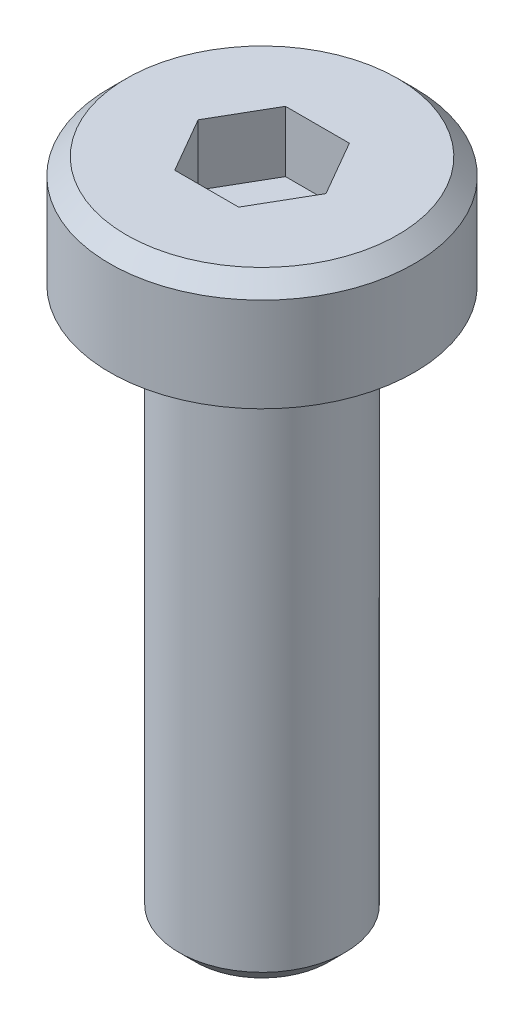
ISO-10303-21;
HEADER;
FILE_DESCRIPTION(('STEP AP214'),'2;1');
FILE_NAME('part.step','',(''),(''),'','','');
FILE_SCHEMA(('AUTOMOTIVE_DESIGN { 1 0 10303 214 1 1 1 1 }'));
ENDSEC;
DATA;
#1=APPLICATION_CONTEXT('core data for automotive mechanical design processes');
#2=APPLICATION_PROTOCOL_DEFINITION('international standard','automotive_design',2000,#1);
#3=PRODUCT_CONTEXT('',#1,'mechanical');
#4=PRODUCT('Part','Part','',(#3));
#5=PRODUCT_RELATED_PRODUCT_CATEGORY('part','',(#4));
#6=PRODUCT_DEFINITION_FORMATION('','',#4);
#7=PRODUCT_DEFINITION_CONTEXT('part definition',#1,'design');
#8=PRODUCT_DEFINITION('design','',#6,#7);
#9=PRODUCT_DEFINITION_SHAPE('','',#8);
#10=(LENGTH_UNIT() NAMED_UNIT(*) SI_UNIT(.MILLI.,.METRE.));
#11=(NAMED_UNIT(*) PLANE_ANGLE_UNIT() SI_UNIT($,.RADIAN.));
#12=(NAMED_UNIT(*) SI_UNIT($,.STERADIAN.) SOLID_ANGLE_UNIT());
#13=UNCERTAINTY_MEASURE_WITH_UNIT(LENGTH_MEASURE(1.E-05),#10,'distance_accuracy_value','');
#14=(GEOMETRIC_REPRESENTATION_CONTEXT(3) GLOBAL_UNCERTAINTY_ASSIGNED_CONTEXT((#13)) GLOBAL_UNIT_ASSIGNED_CONTEXT((#10,
#11,#12)) REPRESENTATION_CONTEXT('',''));
#15=CARTESIAN_POINT('',(0.,0.,0.));
#16=DIRECTION('',(0.,0.,1.));
#17=DIRECTION('',(1.,0.,0.));
#18=AXIS2_PLACEMENT_3D('',#15,#16,#17);
#19=CARTESIAN_POINT('',(0.,-10.,0.));
#20=DIRECTION('',(0.,-1.,0.));
#21=DIRECTION('',(0.,0.,-1.));
#22=AXIS2_PLACEMENT_3D('',#19,#20,#21);
#23=PLANE('',#22);
#24=CARTESIAN_POINT('',(0.,-10.,0.));
#25=DIRECTION('',(0.,-1.,0.));
#26=DIRECTION('',(0.,0.,-1.));
#27=AXIS2_PLACEMENT_3D('',#24,#25,#26);
#28=CIRCLE('',#27,1.2);
#29=CARTESIAN_POINT('',(0.,-10.,-1.2));
#30=VERTEX_POINT('',#29);
#31=EDGE_CURVE('E11',#30,#30,#28,.T.);
#32=ORIENTED_EDGE('',*,*,#31,.T.);
#33=EDGE_LOOP('',(#32));
#34=FACE_BOUND('',#33,.T.);
#35=ADVANCED_FACE('F44',(#34),#23,.T.);
#36=CARTESIAN_POINT('',(0.,-10.,0.));
#37=DIRECTION('',(0.,1.,0.));
#38=DIRECTION('',(0.,0.,1.));
#39=AXIS2_PLACEMENT_3D('',#36,#37,#38);
#40=CONICAL_SURFACE('',#39,1.2,0.785398163397446);
#41=CARTESIAN_POINT('',(0.,-9.7,0.));
#42=DIRECTION('',(0.,-1.,0.));
#43=DIRECTION('',(0.,0.,-1.));
#44=AXIS2_PLACEMENT_3D('',#41,#42,#43);
#45=CIRCLE('',#44,1.5);
#46=CARTESIAN_POINT('',(0.,-9.7,-1.5));
#47=VERTEX_POINT('',#46);
#48=EDGE_CURVE('E52',#47,#47,#45,.T.);
#49=ORIENTED_EDGE('',*,*,#48,.T.);
#50=EDGE_LOOP('',(#49));
#51=FACE_BOUND('',#50,.T.);
#52=ORIENTED_EDGE('',*,*,#31,.F.);
#53=EDGE_LOOP('',(#52));
#54=FACE_BOUND('',#53,.T.);
#55=ADVANCED_FACE('F189',(#51,#54),#40,.T.);
#56=CARTESIAN_POINT('',(0.,-12.,0.));
#57=DIRECTION('',(0.,-1.,0.));
#58=DIRECTION('',(0.,0.,-1.));
#59=AXIS2_PLACEMENT_3D('',#56,#57,#58);
#60=CYLINDRICAL_SURFACE('',#59,1.5);
#61=CARTESIAN_POINT('',(0.,0.,0.));
#62=DIRECTION('',(0.,-1.,0.));
#63=DIRECTION('',(0.,0.,-1.));
#64=AXIS2_PLACEMENT_3D('',#61,#62,#63);
#65=CIRCLE('',#64,1.5);
#66=CARTESIAN_POINT('',(0.,0.,-1.5));
#67=VERTEX_POINT('',#66);
#68=EDGE_CURVE('E178',#67,#67,#65,.T.);
#69=ORIENTED_EDGE('',*,*,#68,.T.);
#70=EDGE_LOOP('',(#69));
#71=FACE_BOUND('',#70,.T.);
#72=ORIENTED_EDGE('',*,*,#48,.F.);
#73=EDGE_LOOP('',(#72));
#74=FACE_BOUND('',#73,.T.);
#75=ADVANCED_FACE('F186',(#71,#74),#60,.T.);
#76=CARTESIAN_POINT('',(1.5,0.,0.));
#77=DIRECTION('',(0.,-1.,0.));
#78=DIRECTION('',(0.,0.,-1.));
#79=AXIS2_PLACEMENT_3D('',#76,#77,#78);
#80=PLANE('',#79);
#81=CARTESIAN_POINT('',(0.,0.,0.));
#82=DIRECTION('',(0.,-1.,0.));
#83=DIRECTION('',(0.,0.,-1.));
#84=AXIS2_PLACEMENT_3D('',#81,#82,#83);
#85=CIRCLE('',#84,2.75);
#86=CARTESIAN_POINT('',(0.,0.,-2.75));
#87=VERTEX_POINT('',#86);
#88=EDGE_CURVE('E177',#87,#87,#85,.T.);
#89=ORIENTED_EDGE('',*,*,#88,.T.);
#90=EDGE_LOOP('',(#89));
#91=FACE_BOUND('',#90,.T.);
#92=ORIENTED_EDGE('',*,*,#68,.F.);
#93=EDGE_LOOP('',(#92));
#94=FACE_BOUND('',#93,.T.);
#95=ADVANCED_FACE('F194',(#91,#94),#80,.T.);
#96=CARTESIAN_POINT('',(0.,-12.,0.));
#97=DIRECTION('',(0.,-1.,0.));
#98=DIRECTION('',(0.,0.,-1.));
#99=AXIS2_PLACEMENT_3D('',#96,#97,#98);
#100=CYLINDRICAL_SURFACE('',#99,2.75);
#101=CARTESIAN_POINT('',(0.,1.7,0.));
#102=DIRECTION('',(0.,-1.,0.));
#103=DIRECTION('',(0.,0.,-1.));
#104=AXIS2_PLACEMENT_3D('',#101,#102,#103);
#105=CIRCLE('',#104,2.75);
#106=CARTESIAN_POINT('',(0.,1.7,-2.75));
#107=VERTEX_POINT('',#106);
#108=EDGE_CURVE('E174',#107,#107,#105,.T.);
#109=ORIENTED_EDGE('',*,*,#108,.T.);
#110=EDGE_LOOP('',(#109));
#111=FACE_BOUND('',#110,.T.);
#112=ORIENTED_EDGE('',*,*,#88,.F.);
#113=EDGE_LOOP('',(#112));
#114=FACE_BOUND('',#113,.T.);
#115=ADVANCED_FACE('F200',(#111,#114),#100,.T.);
#116=CARTESIAN_POINT('',(0.,1.7,0.));
#117=DIRECTION('',(0.,-1.,0.));
#118=DIRECTION('',(0.,0.,-1.));
#119=AXIS2_PLACEMENT_3D('',#116,#117,#118);
#120=CONICAL_SURFACE('',#119,2.75,0.785398163397448);
#121=CARTESIAN_POINT('',(0.,2.,0.));
#122=DIRECTION('',(0.,-1.,0.));
#123=DIRECTION('',(0.,0.,-1.));
#124=AXIS2_PLACEMENT_3D('',#121,#122,#123);
#125=CIRCLE('',#124,2.45);
#126=CARTESIAN_POINT('',(0.,2.,-2.45));
#127=VERTEX_POINT('',#126);
#128=EDGE_CURVE('E157',#127,#127,#125,.T.);
#129=ORIENTED_EDGE('',*,*,#128,.T.);
#130=EDGE_LOOP('',(#129));
#131=FACE_BOUND('',#130,.T.);
#132=ORIENTED_EDGE('',*,*,#108,.F.);
#133=EDGE_LOOP('',(#132));
#134=FACE_BOUND('',#133,.T.);
#135=ADVANCED_FACE('F234',(#131,#134),#120,.T.);
#136=CARTESIAN_POINT('',(2.45,2.,0.));
#137=DIRECTION('',(0.,1.,0.));
#138=DIRECTION('',(0.,0.,1.));
#139=AXIS2_PLACEMENT_3D('',#136,#137,#138);
#140=PLANE('',#139);
#141=DIRECTION('',(0.5,0.,-0.866025403784439));
#142=VECTOR('',#141,1.);
#143=CARTESIAN_POINT('',(0.577350269189626,2.,1.));
#144=LINE('',#143,#142);
#145=CARTESIAN_POINT('',(0.577350269189626,2.,1.));
#146=VERTEX_POINT('',#145);
#147=CARTESIAN_POINT('',(1.15470053837925,2.,0.));
#148=VERTEX_POINT('',#147);
#149=EDGE_CURVE('E58',#146,#148,#144,.T.);
#150=ORIENTED_EDGE('',*,*,#149,.F.);
#151=DIRECTION('',(1.,0.,0.));
#152=VECTOR('',#151,1.);
#153=CARTESIAN_POINT('',(-0.577350269189626,2.,1.));
#154=LINE('',#153,#152);
#155=CARTESIAN_POINT('',(-0.577350269189626,2.,1.));
#156=VERTEX_POINT('',#155);
#157=EDGE_CURVE('E153',#156,#146,#154,.T.);
#158=ORIENTED_EDGE('',*,*,#157,.F.);
#159=DIRECTION('',(0.5,0.,0.866025403784439));
#160=VECTOR('',#159,1.);
#161=CARTESIAN_POINT('',(-1.15470053837925,2.,0.));
#162=LINE('',#161,#160);
#163=CARTESIAN_POINT('',(-1.15470053837925,2.,0.));
#164=VERTEX_POINT('',#163);
#165=EDGE_CURVE('E147',#164,#156,#162,.T.);
#166=ORIENTED_EDGE('',*,*,#165,.F.);
#167=DIRECTION('',(-0.5,0.,0.866025403784439));
#168=VECTOR('',#167,1.);
#169=CARTESIAN_POINT('',(-0.577350269189626,2.,-1.));
#170=LINE('',#169,#168);
#171=CARTESIAN_POINT('',(-0.577350269189626,2.,-1.));
#172=VERTEX_POINT('',#171);
#173=EDGE_CURVE('E107',#172,#164,#170,.T.);
#174=ORIENTED_EDGE('',*,*,#173,.F.);
#175=DIRECTION('',(-1.,0.,0.));
#176=VECTOR('',#175,1.);
#177=CARTESIAN_POINT('',(0.577350269189626,2.,-1.));
#178=LINE('',#177,#176);
#179=CARTESIAN_POINT('',(0.577350269189626,2.,-1.));
#180=VERTEX_POINT('',#179);
#181=EDGE_CURVE('E145',#180,#172,#178,.T.);
#182=ORIENTED_EDGE('',*,*,#181,.F.);
#183=DIRECTION('',(-0.5,0.,-0.866025403784439));
#184=VECTOR('',#183,1.);
#185=CARTESIAN_POINT('',(1.15470053837925,2.,0.));
#186=LINE('',#185,#184);
#187=EDGE_CURVE('E138',#148,#180,#186,.T.);
#188=ORIENTED_EDGE('',*,*,#187,.F.);
#189=EDGE_LOOP('',(#150,#158,#166,#174,#182,#188));
#190=FACE_BOUND('',#189,.T.);
#191=ORIENTED_EDGE('',*,*,#128,.F.);
#192=EDGE_LOOP('',(#191));
#193=FACE_BOUND('',#192,.T.);
#194=ADVANCED_FACE('F244',(#190,#193),#140,.T.);
#195=CARTESIAN_POINT('',(0.577350269189626,0.9,1.));
#196=DIRECTION('',(0.866025403784439,0.,0.5));
#197=DIRECTION('',(0.5,0.,-0.866025403784439));
#198=AXIS2_PLACEMENT_3D('',#195,#196,#197);
#199=PLANE('',#198);
#200=ORIENTED_EDGE('',*,*,#149,.T.);
#201=DIRECTION('',(0.,1.,0.));
#202=VECTOR('',#201,1.);
#203=CARTESIAN_POINT('',(1.15470053837925,0.9,0.));
#204=LINE('',#203,#202);
#205=CARTESIAN_POINT('',(1.15470053837925,0.9,0.));
#206=VERTEX_POINT('',#205);
#207=EDGE_CURVE('E89',#206,#148,#204,.T.);
#208=ORIENTED_EDGE('',*,*,#207,.F.);
#209=DIRECTION('',(0.5,0.,-0.866025403784439));
#210=VECTOR('',#209,1.);
#211=CARTESIAN_POINT('',(0.577350269189626,0.9,1.));
#212=LINE('',#211,#210);
#213=CARTESIAN_POINT('',(0.577350269189626,0.9,1.));
#214=VERTEX_POINT('',#213);
#215=EDGE_CURVE('E156',#214,#206,#212,.T.);
#216=ORIENTED_EDGE('',*,*,#215,.F.);
#217=DIRECTION('',(0.,1.,0.));
#218=VECTOR('',#217,1.);
#219=CARTESIAN_POINT('',(0.577350269189626,0.9,1.));
#220=LINE('',#219,#218);
#221=EDGE_CURVE('E70',#214,#146,#220,.T.);
#222=ORIENTED_EDGE('',*,*,#221,.T.);
#223=EDGE_LOOP('',(#200,#208,#216,#222));
#224=FACE_BOUND('',#223,.T.);
#225=ADVANCED_FACE('F252',(#224),#199,.F.);
#226=CARTESIAN_POINT('',(-0.577350269189626,0.9,1.));
#227=DIRECTION('',(0.,0.,1.));
#228=DIRECTION('',(1.,0.,0.));
#229=AXIS2_PLACEMENT_3D('',#226,#227,#228);
#230=PLANE('',#229);
#231=ORIENTED_EDGE('',*,*,#157,.T.);
#232=ORIENTED_EDGE('',*,*,#221,.F.);
#233=DIRECTION('',(1.,0.,0.));
#234=VECTOR('',#233,1.);
#235=CARTESIAN_POINT('',(-0.577350269189626,0.9,1.));
#236=LINE('',#235,#234);
#237=CARTESIAN_POINT('',(-0.577350269189626,0.9,1.));
#238=VERTEX_POINT('',#237);
#239=EDGE_CURVE('E124',#238,#214,#236,.T.);
#240=ORIENTED_EDGE('',*,*,#239,.F.);
#241=DIRECTION('',(0.,1.,0.));
#242=VECTOR('',#241,1.);
#243=CARTESIAN_POINT('',(-0.577350269189626,0.9,1.));
#244=LINE('',#243,#242);
#245=EDGE_CURVE('E114',#238,#156,#244,.T.);
#246=ORIENTED_EDGE('',*,*,#245,.T.);
#247=EDGE_LOOP('',(#231,#232,#240,#246));
#248=FACE_BOUND('',#247,.T.);
#249=ADVANCED_FACE('F265',(#248),#230,.F.);
#250=CARTESIAN_POINT('',(-1.15470053837925,0.9,0.));
#251=DIRECTION('',(-0.866025403784439,0.,0.5));
#252=DIRECTION('',(0.5,0.,0.866025403784439));
#253=AXIS2_PLACEMENT_3D('',#250,#251,#252);
#254=PLANE('',#253);
#255=ORIENTED_EDGE('',*,*,#165,.T.);
#256=ORIENTED_EDGE('',*,*,#245,.F.);
#257=DIRECTION('',(0.5,0.,0.866025403784439));
#258=VECTOR('',#257,1.);
#259=CARTESIAN_POINT('',(-1.15470053837925,0.9,0.));
#260=LINE('',#259,#258);
#261=CARTESIAN_POINT('',(-1.15470053837925,0.9,0.));
#262=VERTEX_POINT('',#261);
#263=EDGE_CURVE('E119',#262,#238,#260,.T.);
#264=ORIENTED_EDGE('',*,*,#263,.F.);
#265=DIRECTION('',(0.,1.,0.));
#266=VECTOR('',#265,1.);
#267=CARTESIAN_POINT('',(-1.15470053837925,0.9,0.));
#268=LINE('',#267,#266);
#269=EDGE_CURVE('E101',#262,#164,#268,.T.);
#270=ORIENTED_EDGE('',*,*,#269,.T.);
#271=EDGE_LOOP('',(#255,#256,#264,#270));
#272=FACE_BOUND('',#271,.T.);
#273=ADVANCED_FACE('F117',(#272),#254,.F.);
#274=CARTESIAN_POINT('',(-0.577350269189626,0.9,-1.));
#275=DIRECTION('',(-0.866025403784438,0.,-0.5));
#276=DIRECTION('',(-0.5,0.,0.866025403784439));
#277=AXIS2_PLACEMENT_3D('',#274,#275,#276);
#278=PLANE('',#277);
#279=ORIENTED_EDGE('',*,*,#173,.T.);
#280=ORIENTED_EDGE('',*,*,#269,.F.);
#281=DIRECTION('',(-0.5,0.,0.866025403784439));
#282=VECTOR('',#281,1.);
#283=CARTESIAN_POINT('',(-0.577350269189626,0.9,-1.));
#284=LINE('',#283,#282);
#285=CARTESIAN_POINT('',(-0.577350269189626,0.9,-1.));
#286=VERTEX_POINT('',#285);
#287=EDGE_CURVE('E104',#286,#262,#284,.T.);
#288=ORIENTED_EDGE('',*,*,#287,.F.);
#289=DIRECTION('',(0.,1.,0.));
#290=VECTOR('',#289,1.);
#291=CARTESIAN_POINT('',(-0.577350269189626,0.9,-1.));
#292=LINE('',#291,#290);
#293=EDGE_CURVE('E111',#286,#172,#292,.T.);
#294=ORIENTED_EDGE('',*,*,#293,.T.);
#295=EDGE_LOOP('',(#279,#280,#288,#294));
#296=FACE_BOUND('',#295,.T.);
#297=ADVANCED_FACE('F103',(#296),#278,.F.);
#298=CARTESIAN_POINT('',(0.577350269189626,0.9,-1.));
#299=DIRECTION('',(0.,0.,-1.));
#300=DIRECTION('',(-1.,0.,0.));
#301=AXIS2_PLACEMENT_3D('',#298,#299,#300);
#302=PLANE('',#301);
#303=ORIENTED_EDGE('',*,*,#181,.T.);
#304=ORIENTED_EDGE('',*,*,#293,.F.);
#305=DIRECTION('',(-1.,0.,0.));
#306=VECTOR('',#305,1.);
#307=CARTESIAN_POINT('',(0.577350269189626,0.9,-1.));
#308=LINE('',#307,#306);
#309=CARTESIAN_POINT('',(0.577350269189626,0.9,-1.));
#310=VERTEX_POINT('',#309);
#311=EDGE_CURVE('E126',#310,#286,#308,.T.);
#312=ORIENTED_EDGE('',*,*,#311,.F.);
#313=DIRECTION('',(0.,1.,0.));
#314=VECTOR('',#313,1.);
#315=CARTESIAN_POINT('',(0.577350269189626,0.9,-1.));
#316=LINE('',#315,#314);
#317=EDGE_CURVE('E163',#310,#180,#316,.T.);
#318=ORIENTED_EDGE('',*,*,#317,.T.);
#319=EDGE_LOOP('',(#303,#304,#312,#318));
#320=FACE_BOUND('',#319,.T.);
#321=ADVANCED_FACE('F289',(#320),#302,.F.);
#322=CARTESIAN_POINT('',(1.15470053837925,0.9,0.));
#323=DIRECTION('',(0.866025403784439,0.,-0.5));
#324=DIRECTION('',(-0.5,0.,-0.866025403784439));
#325=AXIS2_PLACEMENT_3D('',#322,#323,#324);
#326=PLANE('',#325);
#327=ORIENTED_EDGE('',*,*,#187,.T.);
#328=ORIENTED_EDGE('',*,*,#317,.F.);
#329=DIRECTION('',(-0.5,0.,-0.866025403784439));
#330=VECTOR('',#329,1.);
#331=CARTESIAN_POINT('',(1.15470053837925,0.9,0.));
#332=LINE('',#331,#330);
#333=EDGE_CURVE('E134',#206,#310,#332,.T.);
#334=ORIENTED_EDGE('',*,*,#333,.F.);
#335=ORIENTED_EDGE('',*,*,#207,.T.);
#336=EDGE_LOOP('',(#327,#328,#334,#335));
#337=FACE_BOUND('',#336,.T.);
#338=ADVANCED_FACE('F298',(#337),#326,.F.);
#339=CARTESIAN_POINT('',(0.,0.9,0.));
#340=DIRECTION('',(0.,1.,0.));
#341=DIRECTION('',(0.,0.,1.));
#342=AXIS2_PLACEMENT_3D('',#339,#340,#341);
#343=PLANE('',#342);
#344=ORIENTED_EDGE('',*,*,#215,.T.);
#345=ORIENTED_EDGE('',*,*,#333,.T.);
#346=ORIENTED_EDGE('',*,*,#311,.T.);
#347=ORIENTED_EDGE('',*,*,#287,.T.);
#348=ORIENTED_EDGE('',*,*,#263,.T.);
#349=ORIENTED_EDGE('',*,*,#239,.T.);
#350=EDGE_LOOP('',(#344,#345,#346,#347,#348,#349));
#351=FACE_BOUND('',#350,.T.);
#352=ADVANCED_FACE('F123',(#351),#343,.T.);
#353=CLOSED_SHELL('',(#35,#55,#75,#95,#115,#135,#194,#225,#249,#273,#297,#321,#338,#352));
#354=MANIFOLD_SOLID_BREP('B2',#353);
#355=ADVANCED_BREP_SHAPE_REPRESENTATION('',(#18,#354),#14);
#356=SHAPE_DEFINITION_REPRESENTATION(#9,#355);
ENDSEC;
END-ISO-10303-21;
